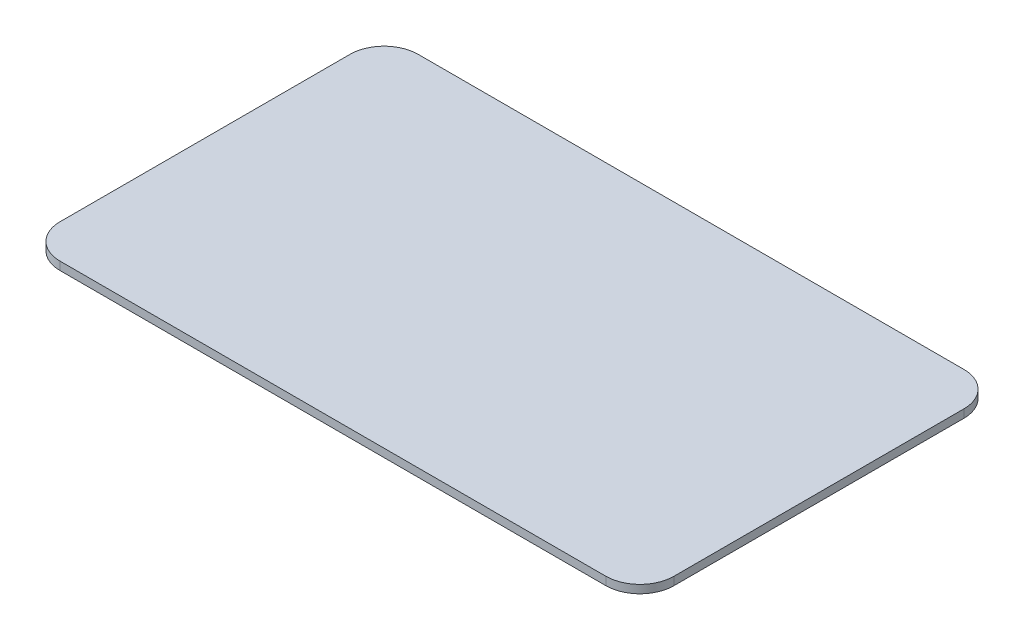
ISO-10303-21;
HEADER;
FILE_DESCRIPTION(('STEP AP214'),'2;1');
FILE_NAME('part.step','',(''),(''),'','','');
FILE_SCHEMA(('AUTOMOTIVE_DESIGN { 1 0 10303 214 1 1 1 1 }'));
ENDSEC;
DATA;
#1=APPLICATION_CONTEXT('core data for automotive mechanical design processes');
#2=APPLICATION_PROTOCOL_DEFINITION('international standard','automotive_design',2000,#1);
#3=PRODUCT_CONTEXT('',#1,'mechanical');
#4=PRODUCT('Part','Part','',(#3));
#5=PRODUCT_RELATED_PRODUCT_CATEGORY('part','',(#4));
#6=PRODUCT_DEFINITION_FORMATION('','',#4);
#7=PRODUCT_DEFINITION_CONTEXT('part definition',#1,'design');
#8=PRODUCT_DEFINITION('design','',#6,#7);
#9=PRODUCT_DEFINITION_SHAPE('','',#8);
#10=(LENGTH_UNIT() NAMED_UNIT(*) SI_UNIT(.MILLI.,.METRE.));
#11=(NAMED_UNIT(*) PLANE_ANGLE_UNIT() SI_UNIT($,.RADIAN.));
#12=(NAMED_UNIT(*) SI_UNIT($,.STERADIAN.) SOLID_ANGLE_UNIT());
#13=UNCERTAINTY_MEASURE_WITH_UNIT(LENGTH_MEASURE(1.E-05),#10,'distance_accuracy_value','');
#14=(GEOMETRIC_REPRESENTATION_CONTEXT(3) GLOBAL_UNCERTAINTY_ASSIGNED_CONTEXT((#13)) GLOBAL_UNIT_ASSIGNED_CONTEXT((#10,
#11,#12)) REPRESENTATION_CONTEXT('',''));
#15=CARTESIAN_POINT('',(0.,0.,0.));
#16=DIRECTION('',(0.,0.,1.));
#17=DIRECTION('',(1.,0.,0.));
#18=AXIS2_PLACEMENT_3D('',#15,#16,#17);
#19=CARTESIAN_POINT('',(-57.15,1.524,-33.3375));
#20=DIRECTION('',(1.,0.,0.));
#21=DIRECTION('',(0.,0.,-1.));
#22=AXIS2_PLACEMENT_3D('',#19,#20,#21);
#23=PLANE('',#22);
#24=DIRECTION('',(0.,0.,1.));
#25=VECTOR('',#24,1.);
#26=CARTESIAN_POINT('',(-57.15,0.,-33.3375));
#27=LINE('',#26,#25);
#28=CARTESIAN_POINT('',(-57.15,0.,-26.9875));
#29=VERTEX_POINT('',#28);
#30=CARTESIAN_POINT('',(-57.15,0.,26.9875));
#31=VERTEX_POINT('',#30);
#32=EDGE_CURVE('E142',#29,#31,#27,.T.);
#33=ORIENTED_EDGE('',*,*,#32,.T.);
#34=DIRECTION('',(0.,-1.,0.));
#35=VECTOR('',#34,1.);
#36=CARTESIAN_POINT('',(-57.15,1.524,26.9875));
#37=LINE('',#36,#35);
#38=CARTESIAN_POINT('',(-57.15,1.524,26.9875));
#39=VERTEX_POINT('',#38);
#40=EDGE_CURVE('E117',#31,#39,#37,.F.);
#41=ORIENTED_EDGE('',*,*,#40,.T.);
#42=DIRECTION('',(0.,0.,1.));
#43=VECTOR('',#42,1.);
#44=CARTESIAN_POINT('',(-57.15,1.524,-33.3375));
#45=LINE('',#44,#43);
#46=CARTESIAN_POINT('',(-57.15,1.524,-26.9875));
#47=VERTEX_POINT('',#46);
#48=EDGE_CURVE('E154',#47,#39,#45,.T.);
#49=ORIENTED_EDGE('',*,*,#48,.F.);
#50=DIRECTION('',(0.,-1.,0.));
#51=VECTOR('',#50,1.);
#52=CARTESIAN_POINT('',(-57.15,1.524,-26.9875));
#53=LINE('',#52,#51);
#54=EDGE_CURVE('E123',#47,#29,#53,.T.);
#55=ORIENTED_EDGE('',*,*,#54,.T.);
#56=EDGE_LOOP('',(#33,#41,#49,#55));
#57=FACE_BOUND('',#56,.T.);
#58=ADVANCED_FACE('F45',(#57),#23,.F.);
#59=CARTESIAN_POINT('',(57.15,1.524,33.3375));
#60=DIRECTION('',(0.,0.,-1.));
#61=DIRECTION('',(-1.,0.,0.));
#62=AXIS2_PLACEMENT_3D('',#59,#60,#61);
#63=PLANE('',#62);
#64=DIRECTION('',(1.,0.,0.));
#65=VECTOR('',#64,1.);
#66=CARTESIAN_POINT('',(57.15,1.524,33.3375));
#67=LINE('',#66,#65);
#68=CARTESIAN_POINT('',(-50.8,1.524,33.3375));
#69=VERTEX_POINT('',#68);
#70=CARTESIAN_POINT('',(50.8,1.524,33.3375));
#71=VERTEX_POINT('',#70);
#72=EDGE_CURVE('E133',#69,#71,#67,.T.);
#73=ORIENTED_EDGE('',*,*,#72,.F.);
#74=DIRECTION('',(0.,-1.,0.));
#75=VECTOR('',#74,1.);
#76=CARTESIAN_POINT('',(-50.8,1.524,33.3375));
#77=LINE('',#76,#75);
#78=CARTESIAN_POINT('',(-50.8,0.,33.3375));
#79=VERTEX_POINT('',#78);
#80=EDGE_CURVE('E116',#69,#79,#77,.T.);
#81=ORIENTED_EDGE('',*,*,#80,.T.);
#82=DIRECTION('',(1.,0.,0.));
#83=VECTOR('',#82,1.);
#84=CARTESIAN_POINT('',(57.15,0.,33.3375));
#85=LINE('',#84,#83);
#86=CARTESIAN_POINT('',(50.8,0.,33.3375));
#87=VERTEX_POINT('',#86);
#88=EDGE_CURVE('E130',#79,#87,#85,.T.);
#89=ORIENTED_EDGE('',*,*,#88,.T.);
#90=DIRECTION('',(0.,-1.,0.));
#91=VECTOR('',#90,1.);
#92=CARTESIAN_POINT('',(50.8,1.524,33.3375));
#93=LINE('',#92,#91);
#94=EDGE_CURVE('E136',#87,#71,#93,.F.);
#95=ORIENTED_EDGE('',*,*,#94,.T.);
#96=EDGE_LOOP('',(#73,#81,#89,#95));
#97=FACE_BOUND('',#96,.T.);
#98=ADVANCED_FACE('F129',(#97),#63,.F.);
#99=CARTESIAN_POINT('',(57.15,1.524,-33.3375));
#100=DIRECTION('',(-1.,0.,0.));
#101=DIRECTION('',(0.,0.,1.));
#102=AXIS2_PLACEMENT_3D('',#99,#100,#101);
#103=PLANE('',#102);
#104=DIRECTION('',(0.,0.,-1.));
#105=VECTOR('',#104,1.);
#106=CARTESIAN_POINT('',(57.15,1.524,-33.3375));
#107=LINE('',#106,#105);
#108=CARTESIAN_POINT('',(57.15,1.524,26.9875));
#109=VERTEX_POINT('',#108);
#110=CARTESIAN_POINT('',(57.15,1.524,-26.9875));
#111=VERTEX_POINT('',#110);
#112=EDGE_CURVE('E190',#109,#111,#107,.T.);
#113=ORIENTED_EDGE('',*,*,#112,.F.);
#114=DIRECTION('',(0.,-1.,0.));
#115=VECTOR('',#114,1.);
#116=CARTESIAN_POINT('',(57.15,1.524,26.9875));
#117=LINE('',#116,#115);
#118=CARTESIAN_POINT('',(57.15,0.,26.9875));
#119=VERTEX_POINT('',#118);
#120=EDGE_CURVE('E184',#109,#119,#117,.T.);
#121=ORIENTED_EDGE('',*,*,#120,.T.);
#122=DIRECTION('',(0.,0.,-1.));
#123=VECTOR('',#122,1.);
#124=CARTESIAN_POINT('',(57.15,0.,-33.3375));
#125=LINE('',#124,#123);
#126=CARTESIAN_POINT('',(57.15,0.,-26.9875));
#127=VERTEX_POINT('',#126);
#128=EDGE_CURVE('E141',#119,#127,#125,.T.);
#129=ORIENTED_EDGE('',*,*,#128,.T.);
#130=DIRECTION('',(0.,-1.,0.));
#131=VECTOR('',#130,1.);
#132=CARTESIAN_POINT('',(57.15,1.524,-26.9875));
#133=LINE('',#132,#131);
#134=EDGE_CURVE('E181',#127,#111,#133,.F.);
#135=ORIENTED_EDGE('',*,*,#134,.T.);
#136=EDGE_LOOP('',(#113,#121,#129,#135));
#137=FACE_BOUND('',#136,.T.);
#138=ADVANCED_FACE('F211',(#137),#103,.F.);
#139=CARTESIAN_POINT('',(57.15,1.524,-33.3375));
#140=DIRECTION('',(0.,0.,1.));
#141=DIRECTION('',(1.,0.,0.));
#142=AXIS2_PLACEMENT_3D('',#139,#140,#141);
#143=PLANE('',#142);
#144=DIRECTION('',(-1.,0.,0.));
#145=VECTOR('',#144,1.);
#146=CARTESIAN_POINT('',(57.15,1.524,-33.3375));
#147=LINE('',#146,#145);
#148=CARTESIAN_POINT('',(50.8,1.524,-33.3375));
#149=VERTEX_POINT('',#148);
#150=CARTESIAN_POINT('',(-50.8,1.524,-33.3375));
#151=VERTEX_POINT('',#150);
#152=EDGE_CURVE('E156',#149,#151,#147,.T.);
#153=ORIENTED_EDGE('',*,*,#152,.F.);
#154=DIRECTION('',(0.,-1.,0.));
#155=VECTOR('',#154,1.);
#156=CARTESIAN_POINT('',(50.8,1.524,-33.3375));
#157=LINE('',#156,#155);
#158=CARTESIAN_POINT('',(50.8,0.,-33.3375));
#159=VERTEX_POINT('',#158);
#160=EDGE_CURVE('E11',#149,#159,#157,.T.);
#161=ORIENTED_EDGE('',*,*,#160,.T.);
#162=DIRECTION('',(-1.,0.,0.));
#163=VECTOR('',#162,1.);
#164=CARTESIAN_POINT('',(57.15,0.,-33.3375));
#165=LINE('',#164,#163);
#166=CARTESIAN_POINT('',(-50.8,0.,-33.3375));
#167=VERTEX_POINT('',#166);
#168=EDGE_CURVE('E147',#159,#167,#165,.T.);
#169=ORIENTED_EDGE('',*,*,#168,.T.);
#170=DIRECTION('',(0.,-1.,0.));
#171=VECTOR('',#170,1.);
#172=CARTESIAN_POINT('',(-50.8,1.524,-33.3375));
#173=LINE('',#172,#171);
#174=EDGE_CURVE('E54',#167,#151,#173,.F.);
#175=ORIENTED_EDGE('',*,*,#174,.T.);
#176=EDGE_LOOP('',(#153,#161,#169,#175));
#177=FACE_BOUND('',#176,.T.);
#178=ADVANCED_FACE('F204',(#177),#143,.F.);
#179=CARTESIAN_POINT('',(0.,1.524,0.));
#180=DIRECTION('',(0.,-1.,0.));
#181=DIRECTION('',(0.,0.,-1.));
#182=AXIS2_PLACEMENT_3D('',#179,#180,#181);
#183=PLANE('',#182);
#184=ORIENTED_EDGE('',*,*,#48,.T.);
#185=CARTESIAN_POINT('',(-50.8,1.524,26.9875));
#186=DIRECTION('',(0.,-1.,0.));
#187=DIRECTION('',(0.,0.,-1.));
#188=AXIS2_PLACEMENT_3D('',#185,#186,#187);
#189=CIRCLE('',#188,6.35);
#190=EDGE_CURVE('E178',#39,#69,#189,.F.);
#191=ORIENTED_EDGE('',*,*,#190,.T.);
#192=ORIENTED_EDGE('',*,*,#72,.T.);
#193=CARTESIAN_POINT('',(50.8,1.524,26.9875));
#194=DIRECTION('',(0.,-1.,0.));
#195=DIRECTION('',(0.,0.,-1.));
#196=AXIS2_PLACEMENT_3D('',#193,#194,#195);
#197=CIRCLE('',#196,6.35);
#198=EDGE_CURVE('E175',#71,#109,#197,.F.);
#199=ORIENTED_EDGE('',*,*,#198,.T.);
#200=ORIENTED_EDGE('',*,*,#112,.T.);
#201=CARTESIAN_POINT('',(50.8,1.524,-26.9875));
#202=DIRECTION('',(0.,-1.,0.));
#203=DIRECTION('',(0.,0.,-1.));
#204=AXIS2_PLACEMENT_3D('',#201,#202,#203);
#205=CIRCLE('',#204,6.35);
#206=EDGE_CURVE('E67',#111,#149,#205,.F.);
#207=ORIENTED_EDGE('',*,*,#206,.T.);
#208=ORIENTED_EDGE('',*,*,#152,.T.);
#209=CARTESIAN_POINT('',(-50.8,1.524,-26.9875));
#210=DIRECTION('',(0.,-1.,0.));
#211=DIRECTION('',(0.,0.,-1.));
#212=AXIS2_PLACEMENT_3D('',#209,#210,#211);
#213=CIRCLE('',#212,6.35);
#214=EDGE_CURVE('E170',#151,#47,#213,.F.);
#215=ORIENTED_EDGE('',*,*,#214,.T.);
#216=EDGE_LOOP('',(#184,#191,#192,#199,#200,#207,#208,#215));
#217=FACE_BOUND('',#216,.T.);
#218=ADVANCED_FACE('F198',(#217),#183,.F.);
#219=CARTESIAN_POINT('',(0.,0.,0.));
#220=DIRECTION('',(0.,-1.,0.));
#221=DIRECTION('',(0.,0.,-1.));
#222=AXIS2_PLACEMENT_3D('',#219,#220,#221);
#223=PLANE('',#222);
#224=ORIENTED_EDGE('',*,*,#88,.F.);
#225=CARTESIAN_POINT('',(-50.8,0.,26.9875));
#226=DIRECTION('',(0.,-1.,0.));
#227=DIRECTION('',(0.,0.,-1.));
#228=AXIS2_PLACEMENT_3D('',#225,#226,#227);
#229=CIRCLE('',#228,6.35);
#230=EDGE_CURVE('E112',#79,#31,#229,.T.);
#231=ORIENTED_EDGE('',*,*,#230,.T.);
#232=ORIENTED_EDGE('',*,*,#32,.F.);
#233=CARTESIAN_POINT('',(-50.8,0.,-26.9875));
#234=DIRECTION('',(0.,-1.,0.));
#235=DIRECTION('',(0.,0.,-1.));
#236=AXIS2_PLACEMENT_3D('',#233,#234,#235);
#237=CIRCLE('',#236,6.35);
#238=EDGE_CURVE('E135',#29,#167,#237,.T.);
#239=ORIENTED_EDGE('',*,*,#238,.T.);
#240=ORIENTED_EDGE('',*,*,#168,.F.);
#241=CARTESIAN_POINT('',(50.8,0.,-26.9875));
#242=DIRECTION('',(0.,-1.,0.));
#243=DIRECTION('',(0.,0.,-1.));
#244=AXIS2_PLACEMENT_3D('',#241,#242,#243);
#245=CIRCLE('',#244,6.35);
#246=EDGE_CURVE('E160',#159,#127,#245,.T.);
#247=ORIENTED_EDGE('',*,*,#246,.T.);
#248=ORIENTED_EDGE('',*,*,#128,.F.);
#249=CARTESIAN_POINT('',(50.8,0.,26.9875));
#250=DIRECTION('',(0.,-1.,0.));
#251=DIRECTION('',(0.,0.,-1.));
#252=AXIS2_PLACEMENT_3D('',#249,#250,#251);
#253=CIRCLE('',#252,6.35);
#254=EDGE_CURVE('E124',#119,#87,#253,.T.);
#255=ORIENTED_EDGE('',*,*,#254,.T.);
#256=EDGE_LOOP('',(#224,#231,#232,#239,#240,#247,#248,#255));
#257=FACE_BOUND('',#256,.T.);
#258=ADVANCED_FACE('F138',(#257),#223,.T.);
#259=CARTESIAN_POINT('',(-50.8,1.524,26.9875));
#260=DIRECTION('',(0.,-1.,0.));
#261=DIRECTION('',(0.,0.,-1.));
#262=AXIS2_PLACEMENT_3D('',#259,#260,#261);
#263=CYLINDRICAL_SURFACE('',#262,6.35);
#264=ORIENTED_EDGE('',*,*,#190,.F.);
#265=ORIENTED_EDGE('',*,*,#40,.F.);
#266=ORIENTED_EDGE('',*,*,#230,.F.);
#267=ORIENTED_EDGE('',*,*,#80,.F.);
#268=EDGE_LOOP('',(#264,#265,#266,#267));
#269=FACE_BOUND('',#268,.T.);
#270=ADVANCED_FACE('F115',(#269),#263,.T.);
#271=CARTESIAN_POINT('',(50.8,1.524,26.9875));
#272=DIRECTION('',(0.,-1.,0.));
#273=DIRECTION('',(0.,0.,-1.));
#274=AXIS2_PLACEMENT_3D('',#271,#272,#273);
#275=CYLINDRICAL_SURFACE('',#274,6.35);
#276=ORIENTED_EDGE('',*,*,#198,.F.);
#277=ORIENTED_EDGE('',*,*,#94,.F.);
#278=ORIENTED_EDGE('',*,*,#254,.F.);
#279=ORIENTED_EDGE('',*,*,#120,.F.);
#280=EDGE_LOOP('',(#276,#277,#278,#279));
#281=FACE_BOUND('',#280,.T.);
#282=ADVANCED_FACE('F215',(#281),#275,.T.);
#283=CARTESIAN_POINT('',(50.8,1.524,-26.9875));
#284=DIRECTION('',(0.,-1.,0.));
#285=DIRECTION('',(0.,0.,-1.));
#286=AXIS2_PLACEMENT_3D('',#283,#284,#285);
#287=CYLINDRICAL_SURFACE('',#286,6.35);
#288=ORIENTED_EDGE('',*,*,#206,.F.);
#289=ORIENTED_EDGE('',*,*,#134,.F.);
#290=ORIENTED_EDGE('',*,*,#246,.F.);
#291=ORIENTED_EDGE('',*,*,#160,.F.);
#292=EDGE_LOOP('',(#288,#289,#290,#291));
#293=FACE_BOUND('',#292,.T.);
#294=ADVANCED_FACE('F207',(#293),#287,.T.);
#295=CARTESIAN_POINT('',(-50.8,1.524,-26.9875));
#296=DIRECTION('',(0.,-1.,0.));
#297=DIRECTION('',(0.,0.,-1.));
#298=AXIS2_PLACEMENT_3D('',#295,#296,#297);
#299=CYLINDRICAL_SURFACE('',#298,6.35);
#300=ORIENTED_EDGE('',*,*,#214,.F.);
#301=ORIENTED_EDGE('',*,*,#174,.F.);
#302=ORIENTED_EDGE('',*,*,#238,.F.);
#303=ORIENTED_EDGE('',*,*,#54,.F.);
#304=EDGE_LOOP('',(#300,#301,#302,#303));
#305=FACE_BOUND('',#304,.T.);
#306=ADVANCED_FACE('F47',(#305),#299,.T.);
#307=CLOSED_SHELL('',(#58,#98,#138,#178,#218,#258,#270,#282,#294,#306));
#308=MANIFOLD_SOLID_BREP('B2',#307);
#309=ADVANCED_BREP_SHAPE_REPRESENTATION('',(#18,#308),#14);
#310=SHAPE_DEFINITION_REPRESENTATION(#9,#309);
ENDSEC;
END-ISO-10303-21;
